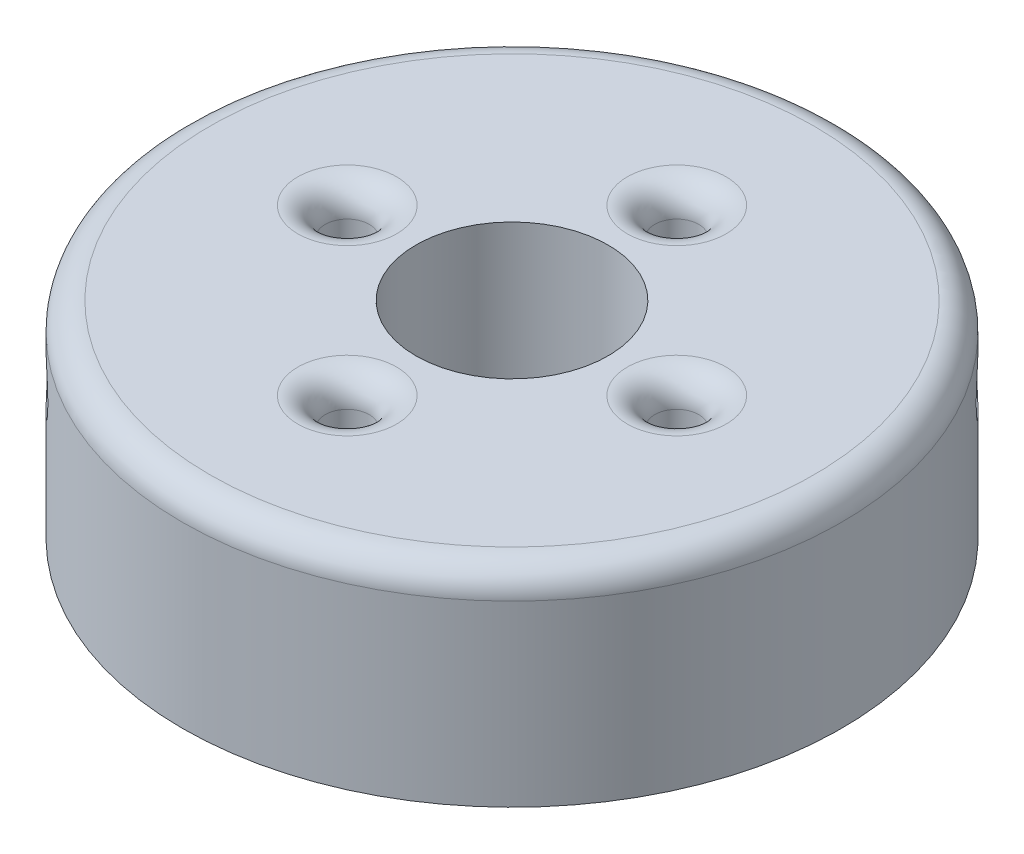
ISO-10303-21;
HEADER;
FILE_DESCRIPTION(('STEP AP214'),'2;1');
FILE_NAME('part.step','',(''),(''),'','','');
FILE_SCHEMA(('AUTOMOTIVE_DESIGN { 1 0 10303 214 1 1 1 1 }'));
ENDSEC;
DATA;
#1=APPLICATION_CONTEXT('core data for automotive mechanical design processes');
#2=APPLICATION_PROTOCOL_DEFINITION('international standard','automotive_design',2000,#1);
#3=PRODUCT_CONTEXT('',#1,'mechanical');
#4=PRODUCT('Part','Part','',(#3));
#5=PRODUCT_RELATED_PRODUCT_CATEGORY('part','',(#4));
#6=PRODUCT_DEFINITION_FORMATION('','',#4);
#7=PRODUCT_DEFINITION_CONTEXT('part definition',#1,'design');
#8=PRODUCT_DEFINITION('design','',#6,#7);
#9=PRODUCT_DEFINITION_SHAPE('','',#8);
#10=(LENGTH_UNIT() NAMED_UNIT(*) SI_UNIT(.MILLI.,.METRE.));
#11=(NAMED_UNIT(*) PLANE_ANGLE_UNIT() SI_UNIT($,.RADIAN.));
#12=(NAMED_UNIT(*) SI_UNIT($,.STERADIAN.) SOLID_ANGLE_UNIT());
#13=UNCERTAINTY_MEASURE_WITH_UNIT(LENGTH_MEASURE(1.E-05),#10,'distance_accuracy_value','');
#14=(GEOMETRIC_REPRESENTATION_CONTEXT(3) GLOBAL_UNCERTAINTY_ASSIGNED_CONTEXT((#13)) GLOBAL_UNIT_ASSIGNED_CONTEXT((#10,
#11,#12)) REPRESENTATION_CONTEXT('',''));
#15=CARTESIAN_POINT('',(0.,0.,0.));
#16=DIRECTION('',(0.,0.,1.));
#17=DIRECTION('',(1.,0.,0.));
#18=AXIS2_PLACEMENT_3D('',#15,#16,#17);
#19=CARTESIAN_POINT('',(0.,15.,0.));
#20=DIRECTION('',(0.,1.,0.));
#21=DIRECTION('',(0.,0.,1.));
#22=AXIS2_PLACEMENT_3D('',#19,#20,#21);
#23=PLANE('',#22);
#24=CARTESIAN_POINT('',(-11.9999999999997,15.,3.4032572508536E-13));
#25=DIRECTION('',(0.,1.,0.));
#26=DIRECTION('',(0.,0.,1.));
#27=AXIS2_PLACEMENT_3D('',#24,#25,#26);
#28=CIRCLE('',#27,3.60000000000054);
#29=CARTESIAN_POINT('',(-11.9999999999997,15.,3.60000000000089));
#30=VERTEX_POINT('',#29);
#31=EDGE_CURVE('E50',#30,#30,#28,.F.);
#32=ORIENTED_EDGE('',*,*,#31,.T.);
#33=EDGE_LOOP('',(#32));
#34=FACE_BOUND('',#33,.T.);
#35=CARTESIAN_POINT('',(6.77712297852766E-13,15.,12.));
#36=DIRECTION('',(0.,1.,0.));
#37=DIRECTION('',(0.,0.,1.));
#38=AXIS2_PLACEMENT_3D('',#35,#36,#37);
#39=CIRCLE('',#38,3.60000000000073);
#40=CARTESIAN_POINT('',(6.77712297852766E-13,15.,15.6000000000007));
#41=VERTEX_POINT('',#40);
#42=EDGE_CURVE('E53',#41,#41,#39,.F.);
#43=ORIENTED_EDGE('',*,*,#42,.T.);
#44=EDGE_LOOP('',(#43));
#45=FACE_BOUND('',#44,.T.);
#46=CARTESIAN_POINT('',(12.,15.,0.));
#47=DIRECTION('',(0.,1.,0.));
#48=DIRECTION('',(0.,0.,1.));
#49=AXIS2_PLACEMENT_3D('',#46,#47,#48);
#50=CIRCLE('',#49,3.6);
#51=CARTESIAN_POINT('',(12.,15.,3.60000000000004));
#52=VERTEX_POINT('',#51);
#53=EDGE_CURVE('E56',#52,#52,#50,.F.);
#54=ORIENTED_EDGE('',*,*,#53,.T.);
#55=EDGE_LOOP('',(#54));
#56=FACE_BOUND('',#55,.T.);
#57=CARTESIAN_POINT('',(0.,15.,-12.));
#58=DIRECTION('',(0.,1.,0.));
#59=DIRECTION('',(0.,0.,1.));
#60=AXIS2_PLACEMENT_3D('',#57,#58,#59);
#61=CIRCLE('',#60,3.6);
#62=CARTESIAN_POINT('',(0.,15.,-8.4));
#63=VERTEX_POINT('',#62);
#64=EDGE_CURVE('E59',#63,#63,#61,.F.);
#65=ORIENTED_EDGE('',*,*,#64,.T.);
#66=EDGE_LOOP('',(#65));
#67=FACE_BOUND('',#66,.T.);
#68=CARTESIAN_POINT('',(0.,15.,0.));
#69=DIRECTION('',(0.,1.,0.));
#70=DIRECTION('',(0.,0.,1.));
#71=AXIS2_PLACEMENT_3D('',#68,#69,#70);
#72=CIRCLE('',#71,22.);
#73=CARTESIAN_POINT('',(0.,15.,22.));
#74=VERTEX_POINT('',#73);
#75=EDGE_CURVE('E62',#74,#74,#72,.T.);
#76=ORIENTED_EDGE('',*,*,#75,.T.);
#77=EDGE_LOOP('',(#76));
#78=FACE_BOUND('',#77,.T.);
#79=CARTESIAN_POINT('',(0.,15.,0.));
#80=DIRECTION('',(0.,1.,0.));
#81=DIRECTION('',(0.,0.,1.));
#82=AXIS2_PLACEMENT_3D('',#79,#80,#81);
#83=CIRCLE('',#82,7.);
#84=CARTESIAN_POINT('',(0.,15.,7.));
#85=VERTEX_POINT('',#84);
#86=EDGE_CURVE('E71',#85,#85,#83,.T.);
#87=ORIENTED_EDGE('',*,*,#86,.F.);
#88=EDGE_LOOP('',(#87));
#89=FACE_BOUND('',#88,.T.);
#90=ADVANCED_FACE('F30',(#34,#45,#56,#67,#78,#89),#23,.T.);
#91=CARTESIAN_POINT('',(0.,0.,0.));
#92=DIRECTION('',(0.,1.,0.));
#93=DIRECTION('',(0.,0.,1.));
#94=AXIS2_PLACEMENT_3D('',#91,#92,#93);
#95=PLANE('',#94);
#96=CARTESIAN_POINT('',(0.,0.,0.));
#97=DIRECTION('',(0.,1.,0.));
#98=DIRECTION('',(0.,0.,1.));
#99=AXIS2_PLACEMENT_3D('',#96,#97,#98);
#100=CIRCLE('',#99,24.);
#101=CARTESIAN_POINT('',(0.,0.,24.));
#102=VERTEX_POINT('',#101);
#103=EDGE_CURVE('E68',#102,#102,#100,.T.);
#104=ORIENTED_EDGE('',*,*,#103,.F.);
#105=EDGE_LOOP('',(#104));
#106=FACE_BOUND('',#105,.T.);
#107=CARTESIAN_POINT('',(0.,0.,0.));
#108=DIRECTION('',(0.,1.,0.));
#109=DIRECTION('',(0.,0.,1.));
#110=AXIS2_PLACEMENT_3D('',#107,#108,#109);
#111=CIRCLE('',#110,7.);
#112=CARTESIAN_POINT('',(0.,0.,7.));
#113=VERTEX_POINT('',#112);
#114=EDGE_CURVE('E72',#113,#113,#111,.T.);
#115=ORIENTED_EDGE('',*,*,#114,.T.);
#116=EDGE_LOOP('',(#115));
#117=FACE_BOUND('',#116,.T.);
#118=CARTESIAN_POINT('',(0.,0.,-12.));
#119=DIRECTION('',(0.,1.,0.));
#120=DIRECTION('',(0.,0.,1.));
#121=AXIS2_PLACEMENT_3D('',#118,#119,#120);
#122=CIRCLE('',#121,1.6);
#123=CARTESIAN_POINT('',(0.,0.,-10.4));
#124=VERTEX_POINT('',#123);
#125=EDGE_CURVE('E75',#124,#124,#122,.T.);
#126=ORIENTED_EDGE('',*,*,#125,.T.);
#127=EDGE_LOOP('',(#126));
#128=FACE_BOUND('',#127,.T.);
#129=CARTESIAN_POINT('',(12.,0.,0.));
#130=DIRECTION('',(0.,1.,0.));
#131=DIRECTION('',(0.,0.,1.));
#132=AXIS2_PLACEMENT_3D('',#129,#130,#131);
#133=CIRCLE('',#132,1.6);
#134=CARTESIAN_POINT('',(12.,0.,1.60000000000004));
#135=VERTEX_POINT('',#134);
#136=EDGE_CURVE('E80',#135,#135,#133,.T.);
#137=ORIENTED_EDGE('',*,*,#136,.T.);
#138=EDGE_LOOP('',(#137));
#139=FACE_BOUND('',#138,.T.);
#140=CARTESIAN_POINT('',(6.77712297852766E-13,0.,12.));
#141=DIRECTION('',(0.,1.,0.));
#142=DIRECTION('',(0.,0.,1.));
#143=AXIS2_PLACEMENT_3D('',#140,#141,#142);
#144=CIRCLE('',#143,1.60000000000073);
#145=CARTESIAN_POINT('',(6.77712297852766E-13,0.,13.6000000000007));
#146=VERTEX_POINT('',#145);
#147=EDGE_CURVE('E83',#146,#146,#144,.T.);
#148=ORIENTED_EDGE('',*,*,#147,.T.);
#149=EDGE_LOOP('',(#148));
#150=FACE_BOUND('',#149,.T.);
#151=CARTESIAN_POINT('',(-11.9999999999997,0.,3.4032572508536E-13));
#152=DIRECTION('',(0.,1.,0.));
#153=DIRECTION('',(0.,0.,1.));
#154=AXIS2_PLACEMENT_3D('',#151,#152,#153);
#155=CIRCLE('',#154,1.60000000000054);
#156=CARTESIAN_POINT('',(-11.9999999999997,0.,1.60000000000088));
#157=VERTEX_POINT('',#156);
#158=EDGE_CURVE('E86',#157,#157,#155,.T.);
#159=ORIENTED_EDGE('',*,*,#158,.T.);
#160=EDGE_LOOP('',(#159));
#161=FACE_BOUND('',#160,.T.);
#162=ADVANCED_FACE('F138',(#106,#117,#128,#139,#150,#161),#95,.F.);
#163=CARTESIAN_POINT('',(0.,15.,0.));
#164=DIRECTION('',(0.,-1.,0.));
#165=DIRECTION('',(0.,0.,-1.));
#166=AXIS2_PLACEMENT_3D('',#163,#164,#165);
#167=CYLINDRICAL_SURFACE('',#166,24.);
#168=CARTESIAN_POINT('',(0.,13.,0.));
#169=DIRECTION('',(0.,1.,0.));
#170=DIRECTION('',(0.,0.,1.));
#171=AXIS2_PLACEMENT_3D('',#168,#169,#170);
#172=CIRCLE('',#171,24.);
#173=CARTESIAN_POINT('',(0.,13.,24.));
#174=VERTEX_POINT('',#173);
#175=EDGE_CURVE('E10',#174,#174,#172,.F.);
#176=ORIENTED_EDGE('',*,*,#175,.T.);
#177=EDGE_LOOP('',(#176));
#178=FACE_BOUND('',#177,.T.);
#179=CARTESIAN_POINT('',(16.9705627484771,12.1,-16.9705627484772));
#180=CARTESIAN_POINT('',(16.8873965318771,12.099994980853,-17.0537273599346));
#181=CARTESIAN_POINT('',(16.8035028549717,12.0900786464956,-17.1363860525195));
#182=CARTESIAN_POINT('',(16.6367954612702,12.0506475393651,-17.2982832321112));
#183=CARTESIAN_POINT('',(16.5539844008014,12.021091402013,-17.3775141236819));
#184=CARTESIAN_POINT('',(16.3921294096786,11.9432394894664,-17.5302727554882));
#185=CARTESIAN_POINT('',(16.3130819789364,11.8949615230449,-17.6038058361385));
#186=CARTESIAN_POINT('',(16.1611796334924,11.7810692887411,-17.743362830007));
#187=CARTESIAN_POINT('',(16.0883219822076,11.715462735327,-17.809390066069));
#188=CARTESIAN_POINT('',(15.9509006117721,11.56856550195,-17.9325770832547));
#189=CARTESIAN_POINT('',(15.8863587091269,11.4872349119069,-17.9897136177986));
#190=CARTESIAN_POINT('',(15.7679110929997,11.3112793779984,-18.0936233026755));
#191=CARTESIAN_POINT('',(15.7140063669731,11.2166532012902,-18.1403954909296));
#192=CARTESIAN_POINT('',(15.6185888116476,11.0166100075109,-18.2226142776648));
#193=CARTESIAN_POINT('',(15.5770958436668,10.9111760539212,-18.2580427301882));
#194=CARTESIAN_POINT('',(15.5080667652993,10.6926289594838,-18.3167117541392));
#195=CARTESIAN_POINT('',(15.4805302639108,10.5795160338696,-18.3399526670113));
#196=CARTESIAN_POINT('',(15.440446644112,10.3491299010852,-18.3737121871072));
#197=CARTESIAN_POINT('',(15.4278611059865,10.2318681581311,-18.3842634041032));
#198=CARTESIAN_POINT('',(15.4180041057602,9.99625471287681,-18.3925309010896));
#199=CARTESIAN_POINT('',(15.4207323567033,9.87790303104178,-18.3902474215816));
#200=CARTESIAN_POINT('',(15.441374653843,9.643815266011,-18.3729182595204));
#201=CARTESIAN_POINT('',(15.4592465702162,9.52807284000494,-18.3579079829672));
#202=CARTESIAN_POINT('',(15.5094830429805,9.30213857627889,-18.3154854537033));
#203=CARTESIAN_POINT('',(15.5418478872584,9.19194684886609,-18.2880729546353));
#204=CARTESIAN_POINT('',(15.6199912065595,8.98006513657812,-18.2213749220341));
#205=CARTESIAN_POINT('',(15.665788545696,8.87838736831227,-18.1820726885286));
#206=CARTESIAN_POINT('',(15.7692051610834,8.68656273819308,-18.0924524038778));
#207=CARTESIAN_POINT('',(15.8268237162258,8.59641517352745,-18.0421350246573));
#208=CARTESIAN_POINT('',(15.9521602470069,8.42989770388173,-17.9314132884883));
#209=CARTESIAN_POINT('',(16.0199097421939,8.35357250290324,-17.8709773777759));
#210=CARTESIAN_POINT('',(16.1631964318063,8.21717854641472,-17.7414878131683));
#211=CARTESIAN_POINT('',(16.2387372312553,8.15711736325732,-17.6724301668719));
#212=CARTESIAN_POINT('',(16.3952293395662,8.05496616657196,-17.527345767971));
#213=CARTESIAN_POINT('',(16.4761856910516,8.01289317965758,-17.4513124949286));
#214=CARTESIAN_POINT('',(16.6408316371197,7.94808362475562,-17.2943802386113));
#215=CARTESIAN_POINT('',(16.7245150344736,7.92530601048152,-17.2134919779612));
#216=CARTESIAN_POINT('',(16.835332439468,7.90831030855115,-17.1047665240695));
#217=CARTESIAN_POINT('',(16.8624172694359,7.90519620461361,-17.0780658881634));
#218=CARTESIAN_POINT('',(16.9165400706527,7.90104023589502,-17.0244566140869));
#219=CARTESIAN_POINT('',(16.9435780418947,7.89999837142016,-16.9975479758857));
#220=CARTESIAN_POINT('',(17.0537273599346,7.90000501914703,-16.8873965318772));
#221=CARTESIAN_POINT('',(17.1363860525195,7.90992135350438,-16.8035028549718));
#222=CARTESIAN_POINT('',(17.2982832321112,7.94935246063488,-16.6367954612702));
#223=CARTESIAN_POINT('',(17.3775141236819,7.97890859798705,-16.5539844008014));
#224=CARTESIAN_POINT('',(17.5302727554881,8.05676051053361,-16.3921294096786));
#225=CARTESIAN_POINT('',(17.6038058361384,8.10503847695511,-16.3130819789365));
#226=CARTESIAN_POINT('',(17.743362830007,8.21893071125895,-16.1611796334925));
#227=CARTESIAN_POINT('',(17.809390066069,8.28453726467305,-16.0883219822077));
#228=CARTESIAN_POINT('',(17.9325770832546,8.43143449805005,-15.9509006117721));
#229=CARTESIAN_POINT('',(17.9897136177985,8.51276508809307,-15.886358709127));
#230=CARTESIAN_POINT('',(18.0936233026755,8.68872062200164,-15.7679110929998));
#231=CARTESIAN_POINT('',(18.1403954909296,8.78334679870981,-15.7140063669731));
#232=CARTESIAN_POINT('',(18.2226142776648,8.98338999248913,-15.6185888116477));
#233=CARTESIAN_POINT('',(18.2580427301881,9.08882394607884,-15.5770958436669));
#234=CARTESIAN_POINT('',(18.3167117541391,9.30737104051616,-15.5080667652994));
#235=CARTESIAN_POINT('',(18.3399526670112,9.42048396613042,-15.4805302639109));
#236=CARTESIAN_POINT('',(18.3737121871071,9.65087009891478,-15.440446644112));
#237=CARTESIAN_POINT('',(18.3842634041032,9.76813184186888,-15.4278611059866));
#238=CARTESIAN_POINT('',(18.3925309010895,10.0037452871232,-15.4180041057603));
#239=CARTESIAN_POINT('',(18.3902474215816,10.1220969689582,-15.4207323567034));
#240=CARTESIAN_POINT('',(18.3729182595203,10.356184733989,-15.4413746538431));
#241=CARTESIAN_POINT('',(18.3579079829671,10.4719271599951,-15.4592465702163));
#242=CARTESIAN_POINT('',(18.3154854537032,10.6978614237211,-15.5094830429806));
#243=CARTESIAN_POINT('',(18.2880729546353,10.8080531511339,-15.5418478872585));
#244=CARTESIAN_POINT('',(18.221374922034,11.0199348634219,-15.6199912065596));
#245=CARTESIAN_POINT('',(18.1820726885285,11.1216126316877,-15.665788545696));
#246=CARTESIAN_POINT('',(18.0924524038777,11.3134372618069,-15.7692051610835));
#247=CARTESIAN_POINT('',(18.0421350246572,11.4035848264726,-15.8268237162259));
#248=CARTESIAN_POINT('',(17.9314132884882,11.5701022961183,-15.952160247007));
#249=CARTESIAN_POINT('',(17.8709773777759,11.6464274970968,-16.0199097421939));
#250=CARTESIAN_POINT('',(17.7414878131682,11.7828214535853,-16.1631964318064));
#251=CARTESIAN_POINT('',(17.6724301668718,11.8428826367427,-16.2387372312554));
#252=CARTESIAN_POINT('',(17.5273457679709,11.945033833428,-16.3952293395663));
#253=CARTESIAN_POINT('',(17.4513124949286,11.9871068203424,-16.4761856910517));
#254=CARTESIAN_POINT('',(17.2943802386113,12.0519163752444,-16.6408316371198));
#255=CARTESIAN_POINT('',(17.2134919779611,12.0746939895185,-16.7245150344737));
#256=CARTESIAN_POINT('',(17.1047665240695,12.0916896914488,-16.8353324394681));
#257=CARTESIAN_POINT('',(17.0780658881633,12.0948037953864,-16.862417269436));
#258=CARTESIAN_POINT('',(17.0244566140868,12.098959764105,-16.9165400706528));
#259=CARTESIAN_POINT('',(16.9975479758857,12.1000016285798,-16.9435780418947));
#260=CARTESIAN_POINT('',(16.9705627484771,12.1,-16.9705627484772));
#261=B_SPLINE_CURVE_WITH_KNOTS('',3,(#179,#180,#181,#182,#183,#184,#185,#186,#187,#188,#189,
#190,#191,#192,#193,#194,#195,#196,#197,#198,#199,#200,#201,#202,#203,#204,#205,#206,#207,#208,
#209,#210,#211,#212,#213,#214,#215,#216,#217,#218,#219,#220,#221,#222,#223,#224,#225,#226,#227,
#228,#229,#230,#231,#232,#233,#234,#235,#236,#237,#238,#239,#240,#241,#242,#243,#244,#245,#246,
#247,#248,#249,#250,#251,#252,#253,#254,#255,#256,#257,#258,#259,#260),.UNSPECIFIED.,.T.,.F.,(4,
2,2,2,2,2,2,2,2,2,2,2,2,2,2,2,2,2,2,2,2,2,2,2,2,2,2,2,2,2,2,2,2,2,2,2,2,2,2,2,4),(0.,
0.352695684018823,0.706136566276324,1.0592420662644,1.41219063232435,1.76604708572854,
2.11993637240101,2.4743889606493,2.82883161806975,3.18236147492319,3.53588470721433,
3.88842765134712,4.24097759868708,4.59402504471181,4.94705096080883,5.30119899344196,
5.65551163120811,6.01015890285043,6.36404983915675,6.47849019994424,6.59293057764035,
6.94562626165917,7.29906714391667,7.65217264390474,8.00512120996469,8.35897766336888,
8.71286695004136,9.06731953828965,9.4217621957101,9.77529205256354,10.1288152848547,
10.4813582289875,10.8339081763274,11.1869556223522,11.5399815384492,11.8941295710823,
12.2484422088485,12.6030894804908,12.9569804167971,13.0714207775846,13.1858611552807),.UNSPECIFIED.);
#262=CARTESIAN_POINT('',(16.9705627484771,12.1,-16.9705627484772));
#263=VERTEX_POINT('',#262);
#264=EDGE_CURVE('E89',#263,#263,#261,.T.);
#265=ORIENTED_EDGE('',*,*,#264,.T.);
#266=EDGE_LOOP('',(#265));
#267=FACE_BOUND('',#266,.T.);
#268=ORIENTED_EDGE('',*,*,#103,.T.);
#269=EDGE_LOOP('',(#268));
#270=FACE_BOUND('',#269,.T.);
#271=CARTESIAN_POINT('',(-18.390396727234,10.,15.4205482462506));
#272=CARTESIAN_POINT('',(-18.3903939581114,10.1177154216135,15.420552735878));
#273=CARTESIAN_POINT('',(-18.3839957467773,10.2355104454101,15.4281919725295));
#274=CARTESIAN_POINT('',(-18.3585155708729,10.4678397056533,15.4585019614747));
#275=CARTESIAN_POINT('',(-18.3394193262405,10.5823701193593,15.4811896369976));
#276=CARTESIAN_POINT('',(-18.2889479717845,10.8047717218145,15.5407817557268));
#277=CARTESIAN_POINT('',(-18.2575799355238,10.9126467054137,15.5776780087994));
#278=CARTESIAN_POINT('',(-18.1832355799542,11.1187382292583,15.6643924183552));
#279=CARTESIAN_POINT('',(-18.1402617011688,11.2169567941781,15.7142078580521));
#280=CARTESIAN_POINT('',(-18.0435070616054,11.4012491496232,15.8252099881285));
#281=CARTESIAN_POINT('',(-17.9896995603993,11.4872919741167,15.8864247866883));
#282=CARTESIAN_POINT('',(-17.8725448403119,11.6445242204984,16.0181113571647));
#283=CARTESIAN_POINT('',(-17.8091972003288,11.7157129863969,16.088583537685));
#284=CARTESIAN_POINT('',(-17.6743351264844,11.8413204662745,16.2366223176304));
#285=CARTESIAN_POINT('',(-17.6028078108498,11.8957122148587,16.3142000679427));
#286=CARTESIAN_POINT('',(-17.4534381331928,11.9860091937453,16.4739017422274));
#287=CARTESIAN_POINT('',(-17.3755958918285,12.0219147771628,16.556025579329));
#288=CARTESIAN_POINT('',(-17.2158396960524,12.0741305872597,16.7220841039697));
#289=CARTESIAN_POINT('',(-17.1339367656256,12.090491134499,16.8060135724578));
#290=CARTESIAN_POINT('',(-16.9681255630059,12.1033080478505,16.9734083428785));
#291=CARTESIAN_POINT('',(-16.88421733157,12.0997648181578,17.0568736542026));
#292=CARTESIAN_POINT('',(-16.7170397613253,12.0729158381087,17.2207505612198));
#293=CARTESIAN_POINT('',(-16.6337693024855,12.0496641990919,17.3011698889944));
#294=CARTESIAN_POINT('',(-16.4701108242439,11.984142604794,17.4570395090307));
#295=CARTESIAN_POINT('',(-16.3897228346481,11.9418724529141,17.5324897499166));
#296=CARTESIAN_POINT('',(-16.2341916635639,11.8394536471149,17.6766028664687));
#297=CARTESIAN_POINT('',(-16.1590557422043,11.7792808265107,17.7452563992782));
#298=CARTESIAN_POINT('',(-16.0165242490263,11.6427823153999,17.8740087845352));
#299=CARTESIAN_POINT('',(-15.9491288506025,11.5664562631556,17.9341074453535));
#300=CARTESIAN_POINT('',(-15.8240595867318,11.3995130814089,18.044559799456));
#301=CARTESIAN_POINT('',(-15.7664190544878,11.3088489201977,18.0948801629436));
#302=CARTESIAN_POINT('',(-15.6630742550639,11.1159668511003,18.1844107661518));
#303=CARTESIAN_POINT('',(-15.6173699992519,11.0137489322106,18.2236209952913));
#304=CARTESIAN_POINT('',(-15.5394710863199,10.8006271131883,18.2900922310061));
#305=CARTESIAN_POINT('',(-15.5072783463927,10.6897219830465,18.3173515418513));
#306=CARTESIAN_POINT('',(-15.457552844969,10.4623902124039,18.3593335498005));
#307=CARTESIAN_POINT('',(-15.4400197431939,10.3459637001315,18.3740565378971));
#308=CARTESIAN_POINT('',(-15.4202768452284,10.1113068769571,18.3906288878533));
#309=CARTESIAN_POINT('',(-15.4180164918659,9.9930838171405,18.3925207245782));
#310=CARTESIAN_POINT('',(-15.4287662997445,9.7578272410225,18.3835039577058));
#311=CARTESIAN_POINT('',(-15.4417763037175,9.64079371248279,18.3725954859378));
#312=CARTESIAN_POINT('',(-15.4825664592582,9.41142787948885,18.3382343154355));
#313=CARTESIAN_POINT('',(-15.5103230614721,9.29908838662945,18.3148016167153));
#314=CARTESIAN_POINT('',(-15.579612657695,9.08207667806885,18.2558956284205));
#315=CARTESIAN_POINT('',(-15.6211458949644,8.97740459779452,18.2204221262355));
#316=CARTESIAN_POINT('',(-15.7166816282245,8.77839821632532,18.1380784764487));
#317=CARTESIAN_POINT('',(-15.7707164635913,8.68409167865627,18.0911787542998));
#318=CARTESIAN_POINT('',(-15.8893715713664,8.50877421919417,17.9870532648594));
#319=CARTESIAN_POINT('',(-15.9539920444589,8.42776354952452,17.9298273017992));
#320=CARTESIAN_POINT('',(-16.0918857216066,8.28111234067878,17.8061730084834));
#321=CARTESIAN_POINT('',(-16.1651821802307,8.2155145833728,17.7397198599194));
#322=CARTESIAN_POINT('',(-16.3179279968059,8.10184501900527,17.599317382647));
#323=CARTESIAN_POINT('',(-16.3973772878673,8.05377302144694,17.5253681354288));
#324=CARTESIAN_POINT('',(-16.5598303796165,7.97659280783293,17.3719449819948));
#325=CARTESIAN_POINT('',(-16.6428290770321,7.9474582801157,17.292478911592));
#326=CARTESIAN_POINT('',(-16.8099701010524,7.90889406131848,17.1300460851549));
#327=CARTESIAN_POINT('',(-16.8941124035314,7.89946395519847,17.0470794028924));
#328=CARTESIAN_POINT('',(-17.0608046865963,7.90058133288938,16.8802488967301));
#329=CARTESIAN_POINT('',(-17.1433590464854,7.91106220436393,16.7963889942715));
#330=CARTESIAN_POINT('',(-17.3048732000784,7.95156493387117,16.6299373831126));
#331=CARTESIAN_POINT('',(-17.3838329893258,7.98158681612971,16.5473456759848));
#332=CARTESIAN_POINT('',(-17.5360709891181,8.06030205348592,16.3859248286997));
#333=CARTESIAN_POINT('',(-17.6093496192586,8.10899402807657,16.3070954108351));
#334=CARTESIAN_POINT('',(-17.7484056298679,8.22365979384783,16.1556392821817));
#335=CARTESIAN_POINT('',(-17.8141831113844,8.2896333521894,16.083012487841));
#336=CARTESIAN_POINT('',(-17.9368841926716,8.4372396802574,15.9460553538394));
#337=CARTESIAN_POINT('',(-17.993778807136,8.51892184992214,15.8817522870003));
#338=CARTESIAN_POINT('',(-18.097185249836,8.69553497377137,15.7638210756076));
#339=CARTESIAN_POINT('',(-18.1436945658705,8.79046912460085,15.7101955142791));
#340=CARTESIAN_POINT('',(-18.2253794891205,8.99109395039495,15.6153603858382));
#341=CARTESIAN_POINT('',(-18.2605319345288,9.09680603633161,15.5741762033023));
#342=CARTESIAN_POINT('',(-18.3185906563701,9.31575941831725,15.5058461672072));
#343=CARTESIAN_POINT('',(-18.3415109507445,9.42899192789427,15.4786842454277));
#344=CARTESIAN_POINT('',(-18.3688308919191,9.61907196731902,15.4462394123328));
#345=CARTESIAN_POINT('',(-18.3769098044866,9.69469861153038,15.4366206595441));
#346=CARTESIAN_POINT('',(-18.387693614767,9.84687227578508,15.4237736257707));
#347=CARTESIAN_POINT('',(-18.3903985287088,9.92341929304828,15.4205453254876));
#348=CARTESIAN_POINT('',(-18.390396727234,10.,15.4205482462506));
#349=B_SPLINE_CURVE_WITH_KNOTS('',3,(#271,#272,#273,#274,#275,#276,#277,#278,#279,#280,#281,
#282,#283,#284,#285,#286,#287,#288,#289,#290,#291,#292,#293,#294,#295,#296,#297,#298,#299,#300,
#301,#302,#303,#304,#305,#306,#307,#308,#309,#310,#311,#312,#313,#314,#315,#316,#317,#318,#319,
#320,#321,#322,#323,#324,#325,#326,#327,#328,#329,#330,#331,#332,#333,#334,#335,#336,#337,#338,
#339,#340,#341,#342,#343,#344,#345,#346,#347,#348),.UNSPECIFIED.,.T.,.F.,(4,2,2,2,2,2,2,2,2,2,2,
2,2,2,2,2,2,2,2,2,2,2,2,2,2,2,2,2,2,2,2,2,2,2,2,2,2,2,4),(0.,0.352866643192248,
0.706130788803118,1.05919160932287,1.4121782445147,1.76604707335824,2.11993152656237,
2.47438117616116,2.82882405495779,3.18235240645583,3.53587357871759,3.88842725685977,
4.24098457951504,4.59401999291751,4.94706331307955,5.30128966576913,5.65551635581575,
6.0097932912559,6.36406200301114,6.71715740683233,7.07024917418683,7.42277876449266,
7.77531457990685,8.12877274485794,8.48223761149887,8.83667230212743,9.19110314010273,
9.54504047435574,9.89897035344774,10.2517182420892,10.6044665680484,10.9571888160614,
11.3099063120051,11.6637517176053,12.017682625823,12.3723308686017,12.7265718099939,
12.9561327140057,13.1856929247661),.UNSPECIFIED.);
#350=CARTESIAN_POINT('',(-18.390396727234,10.,15.4205482462506));
#351=VERTEX_POINT('',#350);
#352=EDGE_CURVE('E97',#351,#351,#349,.T.);
#353=ORIENTED_EDGE('',*,*,#352,.T.);
#354=EDGE_LOOP('',(#353));
#355=FACE_BOUND('',#354,.T.);
#356=ADVANCED_FACE('F102',(#178,#267,#270,#355),#167,.T.);
#357=CARTESIAN_POINT('',(0.,15.,0.));
#358=DIRECTION('',(0.,-1.,0.));
#359=DIRECTION('',(0.,0.,-1.));
#360=AXIS2_PLACEMENT_3D('',#357,#358,#359);
#361=CYLINDRICAL_SURFACE('',#360,7.);
#362=CARTESIAN_POINT('',(-6.20668238762295,10.,3.23683390663947));
#363=CARTESIAN_POINT('',(-6.2066822158892,10.1150723671194,3.23683576165379));
#364=CARTESIAN_POINT('',(-6.2020979084296,10.2301589138016,3.24567100098001));
#365=CARTESIAN_POINT('',(-6.18374349615236,10.4569673494287,3.28050189689963));
#366=CARTESIAN_POINT('',(-6.16997032208962,10.5686881011021,3.30650328726294));
#367=CARTESIAN_POINT('',(-6.13322076053599,10.7854486195804,3.37417700973837));
#368=CARTESIAN_POINT('',(-6.11025967737463,10.8904991614863,3.4158232751069));
#369=CARTESIAN_POINT('',(-6.05505928549271,11.0914707075934,3.51274183828281));
#370=CARTESIAN_POINT('',(-6.02281858773881,11.1873903421582,3.56801617585134));
#371=CARTESIAN_POINT('',(-5.94792954358922,11.3704129468083,3.69154253043477));
#372=CARTESIAN_POINT('',(-5.90500928502696,11.4571842571248,3.76012121321938));
#373=CARTESIAN_POINT('',(-5.80930562279433,11.6164931318515,3.9063529593317));
#374=CARTESIAN_POINT('',(-5.75652095299712,11.6890288666298,3.98400718705306));
#375=CARTESIAN_POINT('',(-5.64018139073558,11.8192477797666,4.14711691871968));
#376=CARTESIAN_POINT('',(-5.57642634782147,11.8765927942199,4.23270054126686));
#377=CARTESIAN_POINT('',(-5.439741783764,11.9725821626599,4.40697767663486));
#378=CARTESIAN_POINT('',(-5.36681424555146,12.0112305498004,4.49567051431837));
#379=CARTESIAN_POINT('',(-5.21545022192875,12.0676320015267,4.6703368049193));
#380=CARTESIAN_POINT('',(-5.13723100598393,12.0859511787138,4.75631547002579));
#381=CARTESIAN_POINT('',(-4.97553945279698,12.102964254505,4.92520680969984));
#382=CARTESIAN_POINT('',(-4.89206822257823,12.1016622751627,5.00812012457361));
#383=CARTESIAN_POINT('',(-4.72515255969809,12.0798499840398,5.16582096725792));
#384=CARTESIAN_POINT('',(-4.64179193498918,12.0599527286662,5.24078318492057));
#385=CARTESIAN_POINT('',(-4.47519142733768,12.002516129608,5.38374571632569));
#386=CARTESIAN_POINT('',(-4.39195155237635,11.9649756686803,5.45174558885059));
#387=CARTESIAN_POINT('',(-4.22738615721779,11.872903167214,5.58034483665013));
#388=CARTESIAN_POINT('',(-4.1460942257282,11.8181783160698,5.64084879278055));
#389=CARTESIAN_POINT('',(-3.98923088837425,11.6934430066005,5.75285496394005));
#390=CARTESIAN_POINT('',(-3.91366084541037,11.6234289218511,5.80435503812847));
#391=CARTESIAN_POINT('',(-3.76819822301116,11.4669231489478,5.89987722008201));
#392=CARTESIAN_POINT('',(-3.69863679793995,11.3799003133584,5.94353453445705));
#393=CARTESIAN_POINT('',(-3.57150343572713,11.1934859749539,6.02078997580435));
#394=CARTESIAN_POINT('',(-3.51393269015143,11.0940932444551,6.05438710319719));
#395=CARTESIAN_POINT('',(-3.41298856020856,10.8844647430514,6.11186797343377));
#396=CARTESIAN_POINT('',(-3.36975661046491,10.7741341357919,6.13565548368128));
#397=CARTESIAN_POINT('',(-3.30062059901873,10.5465499081762,6.17312463142164));
#398=CARTESIAN_POINT('',(-3.27471088460116,10.4292985598516,6.18680956581096));
#399=CARTESIAN_POINT('',(-3.24238236121323,10.195884694965,6.20381172331954));
#400=CARTESIAN_POINT('',(-3.23527306893138,10.0798444865484,6.20749636708204));
#401=CARTESIAN_POINT('',(-3.23896867827916,9.84813793998619,6.2055690801914));
#402=CARTESIAN_POINT('',(-3.249771072257,9.73247155177681,6.19995845088474));
#403=CARTESIAN_POINT('',(-3.28813501259812,9.50791627084078,6.1796936066307));
#404=CARTESIAN_POINT('',(-3.31525388796264,9.39892937003107,6.16527811861172));
#405=CARTESIAN_POINT('',(-3.38444490712873,9.18743763285912,6.12756679490971));
#406=CARTESIAN_POINT('',(-3.42651935970471,9.0849338002032,6.10426958806678));
#407=CARTESIAN_POINT('',(-3.52495240196013,8.88627555029902,6.04797472930556));
#408=CARTESIAN_POINT('',(-3.58166406497992,8.79036539061989,6.01473350257076));
#409=CARTESIAN_POINT('',(-3.70630065791267,8.61030665134688,5.93874173245094));
#410=CARTESIAN_POINT('',(-3.7742282712767,8.52616089534209,5.89598891253515));
#411=CARTESIAN_POINT('',(-3.92136932619807,8.36874743185937,5.79921468254284));
#412=CARTESIAN_POINT('',(-4.00091194797134,8.29601011941823,5.7448288852848));
#413=CARTESIAN_POINT('',(-4.16609031536101,8.16744661856115,5.62619015586018));
#414=CARTESIAN_POINT('',(-4.25172575812012,8.11161959030596,5.56193771395359));
#415=CARTESIAN_POINT('',(-4.42519718843642,8.01899995720439,5.4249184828654));
#416=CARTESIAN_POINT('',(-4.51301136328146,7.98206517737744,5.35222049921596));
#417=CARTESIAN_POINT('',(-4.68825214073288,7.92791471355341,5.19940259597238));
#418=CARTESIAN_POINT('',(-4.77567884709187,7.91069338767222,5.1192848069852));
#419=CARTESIAN_POINT('',(-4.94382092473472,7.8968877383237,4.95699151747069));
#420=CARTESIAN_POINT('',(-5.02466509397291,7.89953422642903,4.87501407444358));
#421=CARTESIAN_POINT('',(-5.18089288003002,7.92355028549877,4.70864840081599));
#422=CARTESIAN_POINT('',(-5.25627680619747,7.94491879487262,4.62426030716856));
#423=CARTESIAN_POINT('',(-5.39903356778876,8.00529632595948,4.45672873351776));
#424=CARTESIAN_POINT('',(-5.46648373667947,8.04411345290862,4.37358161941345));
#425=CARTESIAN_POINT('',(-5.59317768253616,8.13811468031007,4.21035042239863));
#426=CARTESIAN_POINT('',(-5.65242010856996,8.19330147040066,4.13026684528957));
#427=CARTESIAN_POINT('',(-5.76382407004065,8.32052284040205,3.97339766900352));
#428=CARTESIAN_POINT('',(-5.81569838238299,8.39304000200107,3.89679958773334));
#429=CARTESIAN_POINT('',(-5.90977370265954,8.55199454366591,3.75259936850209));
#430=CARTESIAN_POINT('',(-5.9519719159624,8.63843593305741,3.68499983184121));
#431=CARTESIAN_POINT('',(-6.02777227369936,8.82587708963471,3.55970405832291));
#432=CARTESIAN_POINT('',(-6.06108073234473,8.92723397474661,3.50236303262852));
#433=CARTESIAN_POINT('',(-6.11746081688584,9.13977724382542,3.40293390175439));
#434=CARTESIAN_POINT('',(-6.14053736239619,9.25095887304167,3.36083846811635));
#435=CARTESIAN_POINT('',(-6.17460959351477,9.46763660424878,3.29777790474524));
#436=CARTESIAN_POINT('',(-6.18664000028612,9.57245210570339,3.27502313995498));
#437=CARTESIAN_POINT('',(-6.20267567320794,9.78484131149408,3.24455178111055));
#438=CARTESIAN_POINT('',(-6.20668254818339,9.89241445850335,3.23683217231589));
#439=CARTESIAN_POINT('',(-6.20668238762295,10.,3.23683390663947));
#440=B_SPLINE_CURVE_WITH_KNOTS('',3,(#362,#363,#364,#365,#366,#367,#368,#369,#370,#371,#372,
#373,#374,#375,#376,#377,#378,#379,#380,#381,#382,#383,#384,#385,#386,#387,#388,#389,#390,#391,
#392,#393,#394,#395,#396,#397,#398,#399,#400,#401,#402,#403,#404,#405,#406,#407,#408,#409,#410,
#411,#412,#413,#414,#415,#416,#417,#418,#419,#420,#421,#422,#423,#424,#425,#426,#427,#428,#429,
#430,#431,#432,#433,#434,#435,#436,#437,#438,#439),.UNSPECIFIED.,.T.,.F.,(4,2,2,2,2,2,2,2,2,2,2,
2,2,2,2,2,2,2,2,2,2,2,2,2,2,2,2,2,2,2,2,2,2,2,2,2,2,2,4),(0.,0.34482023228176,0.689755698364599,
1.03411898025267,1.37853383551814,1.73282410011177,2.08715987019782,2.44882314983102,
2.81040837823028,3.16164996209381,3.51281775742016,3.85280176387232,4.19280730246526,
4.53677293069947,4.88082023227163,5.23813005832589,5.59547537488608,5.95624733544773,
6.31690150879776,6.66411313106433,7.01127614750343,7.34942032914344,7.68761673464102,
8.03489024533144,8.38224696300492,8.74271308540843,9.10316130253883,9.46085548540055,
9.81844727250355,10.1622682547571,10.5060697426686,10.8461793562111,11.1863448828793,
11.5373947787628,11.8885459368185,12.2501629553681,12.6116059154952,12.9340561540043,
13.2564417304698),.UNSPECIFIED.);
#441=CARTESIAN_POINT('',(-6.20668238762295,10.,3.23683390663947));
#442=VERTEX_POINT('',#441);
#443=EDGE_CURVE('E123',#442,#442,#440,.T.);
#444=ORIENTED_EDGE('',*,*,#443,.F.);
#445=EDGE_LOOP('',(#444));
#446=FACE_BOUND('',#445,.T.);
#447=CARTESIAN_POINT('',(3.23683390663945,10.,-6.20668238762297));
#448=CARTESIAN_POINT('',(3.23683576165377,9.88492763288063,-6.20668221588922));
#449=CARTESIAN_POINT('',(3.24567100097998,9.76984108619836,-6.20209790842961));
#450=CARTESIAN_POINT('',(3.28050189689961,9.54303265057128,-6.18374349615237));
#451=CARTESIAN_POINT('',(3.30650328726292,9.43131189889795,-6.16997032208963));
#452=CARTESIAN_POINT('',(3.37417700973835,9.21455138041958,-6.133220760536));
#453=CARTESIAN_POINT('',(3.41582327510687,9.10950083851368,-6.11025967737464));
#454=CARTESIAN_POINT('',(3.51274183828278,8.90852929240658,-6.05505928549273));
#455=CARTESIAN_POINT('',(3.56801617585131,8.81260965784178,-6.02281858773883));
#456=CARTESIAN_POINT('',(3.69154253043475,8.62958705319167,-5.94792954358923));
#457=CARTESIAN_POINT('',(3.76012121321936,8.5428157428752,-5.90500928502697));
#458=CARTESIAN_POINT('',(3.90635295933169,8.38350686814848,-5.80930562279435));
#459=CARTESIAN_POINT('',(3.98400718705304,8.31097113337017,-5.75652095299713));
#460=CARTESIAN_POINT('',(4.14711691871966,8.18075222023337,-5.64018139073559));
#461=CARTESIAN_POINT('',(4.23270054126684,8.12340720578007,-5.57642634782148));
#462=CARTESIAN_POINT('',(4.40697767663485,8.02741783734014,-5.43974178376402));
#463=CARTESIAN_POINT('',(4.49567051431835,7.98876945019957,-5.36681424555147));
#464=CARTESIAN_POINT('',(4.67033680491928,7.93236799847329,-5.21545022192876));
#465=CARTESIAN_POINT('',(4.75631547002577,7.91404882128622,-5.13723100598394));
#466=CARTESIAN_POINT('',(4.92520680969982,7.89703574549498,-4.975539452797));
#467=CARTESIAN_POINT('',(5.00812012457359,7.89833772483725,-4.89206822257825));
#468=CARTESIAN_POINT('',(5.16582096725791,7.92015001596023,-4.7251525596981));
#469=CARTESIAN_POINT('',(5.24078318492055,7.94004727133382,-4.6417919349892));
#470=CARTESIAN_POINT('',(5.38374571632568,7.99748387039201,-4.47519142733769));
#471=CARTESIAN_POINT('',(5.45174558885058,8.03502433131974,-4.39195155237637));
#472=CARTESIAN_POINT('',(5.58034483665012,8.12709683278598,-4.2273861572178));
#473=CARTESIAN_POINT('',(5.64084879278054,8.18182168393018,-4.14609422572822));
#474=CARTESIAN_POINT('',(5.75285496394003,8.30655699339952,-3.98923088837427));
#475=CARTESIAN_POINT('',(5.80435503812846,8.37657107814888,-3.91366084541038));
#476=CARTESIAN_POINT('',(5.89987722008199,8.53307685105224,-3.76819822301118));
#477=CARTESIAN_POINT('',(5.94353453445704,8.62009968664163,-3.69863679793997));
#478=CARTESIAN_POINT('',(6.02078997580434,8.80651402504607,-3.57150343572715));
#479=CARTESIAN_POINT('',(6.05438710319718,8.90590675554492,-3.51393269015145));
#480=CARTESIAN_POINT('',(6.11186797343375,9.11553525694859,-3.41298856020858));
#481=CARTESIAN_POINT('',(6.13565548368126,9.22586586420809,-3.36975661046493));
#482=CARTESIAN_POINT('',(6.17312463142163,9.45345009182377,-3.30062059901876));
#483=CARTESIAN_POINT('',(6.18680956581095,9.57070144014839,-3.27471088460118));
#484=CARTESIAN_POINT('',(6.20381172331953,9.804115305035,-3.24238236121325));
#485=CARTESIAN_POINT('',(6.20749636708203,9.92015551345158,-3.2352730689314));
#486=CARTESIAN_POINT('',(6.20556908019139,10.1518620600138,-3.23896867827918));
#487=CARTESIAN_POINT('',(6.19995845088472,10.2675284482232,-3.24977107225703));
#488=CARTESIAN_POINT('',(6.17969360663068,10.4920837291592,-3.28813501259815));
#489=CARTESIAN_POINT('',(6.1652781186117,10.6010706299689,-3.31525388796267));
#490=CARTESIAN_POINT('',(6.1275667949097,10.8125623671409,-3.38444490712876));
#491=CARTESIAN_POINT('',(6.10426958806677,10.9150661997968,-3.42651935970473));
#492=CARTESIAN_POINT('',(6.04797472930555,11.113724449701,-3.52495240196016));
#493=CARTESIAN_POINT('',(6.01473350257074,11.2096346093801,-3.58166406497995));
#494=CARTESIAN_POINT('',(5.93874173245093,11.3896933486531,-3.70630065791269));
#495=CARTESIAN_POINT('',(5.89598891253513,11.4738391046579,-3.77422827127673));
#496=CARTESIAN_POINT('',(5.79921468254282,11.6312525681406,-3.9213693261981));
#497=CARTESIAN_POINT('',(5.74482888528478,11.7039898805818,-4.00091194797137));
#498=CARTESIAN_POINT('',(5.62619015586016,11.8325533814389,-4.16609031536103));
#499=CARTESIAN_POINT('',(5.56193771395357,11.8883804096941,-4.25172575812014));
#500=CARTESIAN_POINT('',(5.42491848286538,11.9810000427956,-4.42519718843645));
#501=CARTESIAN_POINT('',(5.35222049921594,12.0179348226226,-4.51301136328148));
#502=CARTESIAN_POINT('',(5.19940259597235,12.0720852864466,-4.6882521407329));
#503=CARTESIAN_POINT('',(5.11928480698518,12.0893066123278,-4.7756788470919));
#504=CARTESIAN_POINT('',(4.95699151747067,12.1031122616763,-4.94382092473474));
#505=CARTESIAN_POINT('',(4.87501407444356,12.100465773571,-5.02466509397294));
#506=CARTESIAN_POINT('',(4.70864840081597,12.0764497145012,-5.18089288003004));
#507=CARTESIAN_POINT('',(4.62426030716853,12.0550812051274,-5.25627680619749));
#508=CARTESIAN_POINT('',(4.45672873351774,11.9947036740405,-5.39903356778878));
#509=CARTESIAN_POINT('',(4.37358161941343,11.9558865470914,-5.46648373667949));
#510=CARTESIAN_POINT('',(4.21035042239861,11.8618853196899,-5.59317768253618));
#511=CARTESIAN_POINT('',(4.13026684528954,11.8066985295993,-5.65242010856998));
#512=CARTESIAN_POINT('',(3.97339766900349,11.6794771595979,-5.76382407004066));
#513=CARTESIAN_POINT('',(3.89679958773331,11.6069599979989,-5.81569838238301));
#514=CARTESIAN_POINT('',(3.75259936850206,11.4480054563341,-5.90977370265956));
#515=CARTESIAN_POINT('',(3.68499983184118,11.3615640669426,-5.95197191596242));
#516=CARTESIAN_POINT('',(3.55970405832288,11.1741229103653,-6.02777227369937));
#517=CARTESIAN_POINT('',(3.5023630326285,11.0727660252534,-6.06108073234475));
#518=CARTESIAN_POINT('',(3.40293390175437,10.8602227561746,-6.11746081688586));
#519=CARTESIAN_POINT('',(3.36083846811632,10.7490411269583,-6.14053736239621));
#520=CARTESIAN_POINT('',(3.29777790474521,10.5323633957512,-6.17460959351478));
#521=CARTESIAN_POINT('',(3.27502313995495,10.4275478942966,-6.18664000028613));
#522=CARTESIAN_POINT('',(3.24455178111053,10.2151586885059,-6.20267567320795));
#523=CARTESIAN_POINT('',(3.23683217231588,10.1075855414967,-6.20668254818341));
#524=CARTESIAN_POINT('',(3.23683390663945,10.,-6.20668238762297));
#525=B_SPLINE_CURVE_WITH_KNOTS('',3,(#447,#448,#449,#450,#451,#452,#453,#454,#455,#456,#457,
#458,#459,#460,#461,#462,#463,#464,#465,#466,#467,#468,#469,#470,#471,#472,#473,#474,#475,#476,
#477,#478,#479,#480,#481,#482,#483,#484,#485,#486,#487,#488,#489,#490,#491,#492,#493,#494,#495,
#496,#497,#498,#499,#500,#501,#502,#503,#504,#505,#506,#507,#508,#509,#510,#511,#512,#513,#514,
#515,#516,#517,#518,#519,#520,#521,#522,#523,#524),.UNSPECIFIED.,.T.,.F.,(4,2,2,2,2,2,2,2,2,2,2,
2,2,2,2,2,2,2,2,2,2,2,2,2,2,2,2,2,2,2,2,2,2,2,2,2,2,2,4),(0.,0.344820232281762,
0.689755698364601,1.03411898025267,1.37853383551815,1.73282410011178,2.08715987019782,
2.44882314983103,2.81040837823028,3.16164996209381,3.51281775742017,3.85280176387233,
4.19280730246527,4.53677293069948,4.88082023227164,5.2381300583259,5.59547537488609,
5.95624733544774,6.31690150879777,6.66411313106434,7.01127614750343,7.34942032914344,
7.68761673464103,8.03489024533144,8.38224696300493,8.74271308540844,9.10316130253884,
9.46085548540056,9.81844727250356,10.1622682547571,10.5060697426686,10.8461793562111,
11.1863448828793,11.5373947787628,11.8885459368185,12.2501629553681,12.6116059154952,
12.9340561540043,13.2564417304698),.UNSPECIFIED.);
#526=CARTESIAN_POINT('',(3.23683390663945,10.,-6.20668238762297));
#527=VERTEX_POINT('',#526);
#528=EDGE_CURVE('E117',#527,#527,#525,.T.);
#529=ORIENTED_EDGE('',*,*,#528,.F.);
#530=EDGE_LOOP('',(#529));
#531=FACE_BOUND('',#530,.T.);
#532=ORIENTED_EDGE('',*,*,#86,.T.);
#533=EDGE_LOOP('',(#532));
#534=FACE_BOUND('',#533,.T.);
#535=ORIENTED_EDGE('',*,*,#114,.F.);
#536=EDGE_LOOP('',(#535));
#537=FACE_BOUND('',#536,.T.);
#538=ADVANCED_FACE('F128',(#446,#531,#534,#537),#361,.F.);
#539=CARTESIAN_POINT('',(0.,15.,-12.));
#540=DIRECTION('',(0.,-1.,0.));
#541=DIRECTION('',(0.,0.,-1.));
#542=AXIS2_PLACEMENT_3D('',#539,#540,#541);
#543=CYLINDRICAL_SURFACE('',#542,1.6);
#544=CARTESIAN_POINT('',(0.,13.,-12.));
#545=DIRECTION('',(0.,1.,0.));
#546=DIRECTION('',(0.,0.,1.));
#547=AXIS2_PLACEMENT_3D('',#544,#545,#546);
#548=CIRCLE('',#547,1.6);
#549=CARTESIAN_POINT('',(0.,13.,-10.4));
#550=VERTEX_POINT('',#549);
#551=EDGE_CURVE('E37',#550,#550,#548,.T.);
#552=ORIENTED_EDGE('',*,*,#551,.T.);
#553=EDGE_LOOP('',(#552));
#554=FACE_BOUND('',#553,.T.);
#555=ORIENTED_EDGE('',*,*,#125,.F.);
#556=EDGE_LOOP('',(#555));
#557=FACE_BOUND('',#556,.T.);
#558=ADVANCED_FACE('F133',(#554,#557),#543,.F.);
#559=CARTESIAN_POINT('',(12.,15.,0.));
#560=DIRECTION('',(0.,-1.,0.));
#561=DIRECTION('',(0.,0.,-1.));
#562=AXIS2_PLACEMENT_3D('',#559,#560,#561);
#563=CYLINDRICAL_SURFACE('',#562,1.6);
#564=CARTESIAN_POINT('',(12.,13.,0.));
#565=DIRECTION('',(0.,1.,0.));
#566=DIRECTION('',(0.,0.,1.));
#567=AXIS2_PLACEMENT_3D('',#564,#565,#566);
#568=CIRCLE('',#567,1.6);
#569=CARTESIAN_POINT('',(12.,13.,1.60000000000004));
#570=VERTEX_POINT('',#569);
#571=EDGE_CURVE('E41',#570,#570,#568,.T.);
#572=ORIENTED_EDGE('',*,*,#571,.T.);
#573=EDGE_LOOP('',(#572));
#574=FACE_BOUND('',#573,.T.);
#575=ORIENTED_EDGE('',*,*,#136,.F.);
#576=EDGE_LOOP('',(#575));
#577=FACE_BOUND('',#576,.T.);
#578=ADVANCED_FACE('F163',(#574,#577),#563,.F.);
#579=CARTESIAN_POINT('',(6.77712297852766E-13,15.,12.));
#580=DIRECTION('',(0.,-1.,0.));
#581=DIRECTION('',(0.,0.,-1.));
#582=AXIS2_PLACEMENT_3D('',#579,#580,#581);
#583=CYLINDRICAL_SURFACE('',#582,1.60000000000073);
#584=CARTESIAN_POINT('',(6.77712297852766E-13,13.,12.));
#585=DIRECTION('',(0.,1.,0.));
#586=DIRECTION('',(0.,0.,1.));
#587=AXIS2_PLACEMENT_3D('',#584,#585,#586);
#588=CIRCLE('',#587,1.60000000000073);
#589=CARTESIAN_POINT('',(6.77712297852766E-13,13.,13.6000000000007));
#590=VERTEX_POINT('',#589);
#591=EDGE_CURVE('E45',#590,#590,#588,.T.);
#592=ORIENTED_EDGE('',*,*,#591,.T.);
#593=EDGE_LOOP('',(#592));
#594=FACE_BOUND('',#593,.T.);
#595=ORIENTED_EDGE('',*,*,#147,.F.);
#596=EDGE_LOOP('',(#595));
#597=FACE_BOUND('',#596,.T.);
#598=ADVANCED_FACE('F158',(#594,#597),#583,.F.);
#599=CARTESIAN_POINT('',(-11.9999999999997,15.,3.4032572508536E-13));
#600=DIRECTION('',(0.,-1.,0.));
#601=DIRECTION('',(0.,0.,-1.));
#602=AXIS2_PLACEMENT_3D('',#599,#600,#601);
#603=CYLINDRICAL_SURFACE('',#602,1.60000000000054);
#604=CARTESIAN_POINT('',(-11.9999999999997,13.,3.4032572508536E-13));
#605=DIRECTION('',(0.,1.,0.));
#606=DIRECTION('',(0.,0.,1.));
#607=AXIS2_PLACEMENT_3D('',#604,#605,#606);
#608=CIRCLE('',#607,1.60000000000054);
#609=CARTESIAN_POINT('',(-11.9999999999997,13.,1.60000000000088));
#610=VERTEX_POINT('',#609);
#611=EDGE_CURVE('E65',#610,#610,#608,.T.);
#612=ORIENTED_EDGE('',*,*,#611,.T.);
#613=EDGE_LOOP('',(#612));
#614=FACE_BOUND('',#613,.T.);
#615=ORIENTED_EDGE('',*,*,#158,.F.);
#616=EDGE_LOOP('',(#615));
#617=FACE_BOUND('',#616,.T.);
#618=ADVANCED_FACE('F111',(#614,#617),#603,.F.);
#619=CARTESIAN_POINT('',(-33.9411254969542,10.,33.9411254969543));
#620=DIRECTION('',(0.707106781186546,0.,-0.707106781186549));
#621=DIRECTION('',(-0.707106781186549,0.,-0.707106781186546));
#622=AXIS2_PLACEMENT_3D('',#619,#620,#621);
#623=CYLINDRICAL_SURFACE('',#622,2.1);
#624=ORIENTED_EDGE('',*,*,#528,.T.);
#625=EDGE_LOOP('',(#624));
#626=FACE_BOUND('',#625,.T.);
#627=ORIENTED_EDGE('',*,*,#264,.F.);
#628=EDGE_LOOP('',(#627));
#629=FACE_BOUND('',#628,.T.);
#630=ADVANCED_FACE('F106',(#626,#629),#623,.F.);
#631=ORIENTED_EDGE('',*,*,#443,.T.);
#632=EDGE_LOOP('',(#631));
#633=FACE_BOUND('',#632,.T.);
#634=ORIENTED_EDGE('',*,*,#352,.F.);
#635=EDGE_LOOP('',(#634));
#636=FACE_BOUND('',#635,.T.);
#637=ADVANCED_FACE('F110',(#633,#636),#623,.F.);
#638=CARTESIAN_POINT('',(-11.9999999999997,13.,3.4032572508536E-13));
#639=DIRECTION('',(0.,1.,0.));
#640=DIRECTION('',(0.,0.,1.));
#641=AXIS2_PLACEMENT_3D('',#638,#639,#640);
#642=TOROIDAL_SURFACE('',#641,3.60000000000054,2.);
#643=ORIENTED_EDGE('',*,*,#31,.F.);
#644=EDGE_LOOP('',(#643));
#645=FACE_BOUND('',#644,.T.);
#646=ORIENTED_EDGE('',*,*,#611,.F.);
#647=EDGE_LOOP('',(#646));
#648=FACE_BOUND('',#647,.T.);
#649=ADVANCED_FACE('F167',(#645,#648),#642,.T.);
#650=CARTESIAN_POINT('',(6.77712297852766E-13,13.,12.));
#651=DIRECTION('',(0.,1.,0.));
#652=DIRECTION('',(0.,0.,1.));
#653=AXIS2_PLACEMENT_3D('',#650,#651,#652);
#654=TOROIDAL_SURFACE('',#653,3.60000000000073,2.);
#655=ORIENTED_EDGE('',*,*,#42,.F.);
#656=EDGE_LOOP('',(#655));
#657=FACE_BOUND('',#656,.T.);
#658=ORIENTED_EDGE('',*,*,#591,.F.);
#659=EDGE_LOOP('',(#658));
#660=FACE_BOUND('',#659,.T.);
#661=ADVANCED_FACE('F169',(#657,#660),#654,.T.);
#662=CARTESIAN_POINT('',(12.,13.,0.));
#663=DIRECTION('',(0.,1.,0.));
#664=DIRECTION('',(0.,0.,1.));
#665=AXIS2_PLACEMENT_3D('',#662,#663,#664);
#666=TOROIDAL_SURFACE('',#665,3.6,2.);
#667=ORIENTED_EDGE('',*,*,#53,.F.);
#668=EDGE_LOOP('',(#667));
#669=FACE_BOUND('',#668,.T.);
#670=ORIENTED_EDGE('',*,*,#571,.F.);
#671=EDGE_LOOP('',(#670));
#672=FACE_BOUND('',#671,.T.);
#673=ADVANCED_FACE('F175',(#669,#672),#666,.T.);
#674=CARTESIAN_POINT('',(0.,13.,-12.));
#675=DIRECTION('',(0.,1.,0.));
#676=DIRECTION('',(0.,0.,1.));
#677=AXIS2_PLACEMENT_3D('',#674,#675,#676);
#678=TOROIDAL_SURFACE('',#677,3.6,2.);
#679=ORIENTED_EDGE('',*,*,#64,.F.);
#680=EDGE_LOOP('',(#679));
#681=FACE_BOUND('',#680,.T.);
#682=ORIENTED_EDGE('',*,*,#551,.F.);
#683=EDGE_LOOP('',(#682));
#684=FACE_BOUND('',#683,.T.);
#685=ADVANCED_FACE('F182',(#681,#684),#678,.T.);
#686=CARTESIAN_POINT('',(0.,13.,0.));
#687=DIRECTION('',(0.,1.,0.));
#688=DIRECTION('',(0.,0.,1.));
#689=AXIS2_PLACEMENT_3D('',#686,#687,#688);
#690=TOROIDAL_SURFACE('',#689,22.,2.);
#691=ORIENTED_EDGE('',*,*,#175,.F.);
#692=EDGE_LOOP('',(#691));
#693=FACE_BOUND('',#692,.T.);
#694=ORIENTED_EDGE('',*,*,#75,.F.);
#695=EDGE_LOOP('',(#694));
#696=FACE_BOUND('',#695,.T.);
#697=ADVANCED_FACE('F32',(#693,#696),#690,.T.);
#698=CLOSED_SHELL('',(#90,#162,#356,#538,#558,#578,#598,#618,#630,#637,#649,#661,#673,#685,#697));
#699=MANIFOLD_SOLID_BREP('B2',#698);
#700=ADVANCED_BREP_SHAPE_REPRESENTATION('',(#18,#699),#14);
#701=SHAPE_DEFINITION_REPRESENTATION(#9,#700);
ENDSEC;
END-ISO-10303-21;
